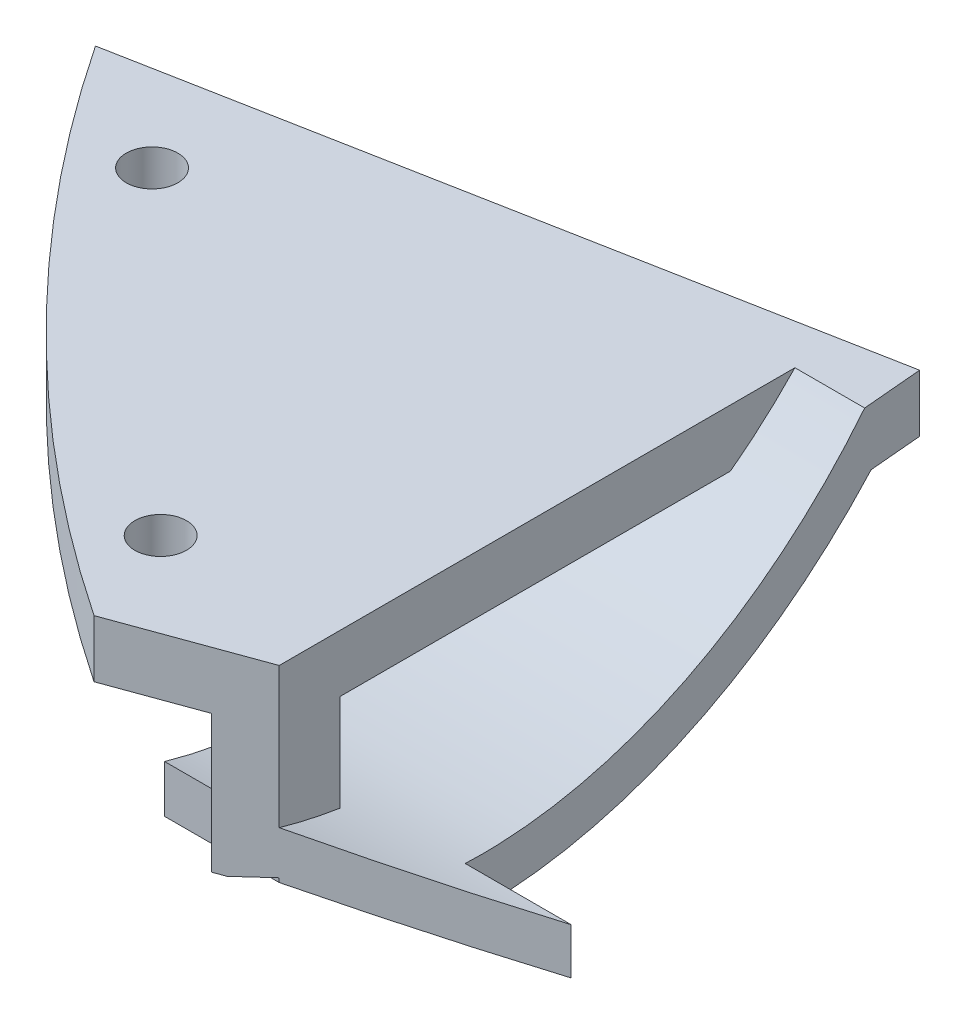
ISO-10303-21;
HEADER;
FILE_DESCRIPTION(('STEP AP214'),'2;1');
FILE_NAME('part.step','',(''),(''),'','','');
FILE_SCHEMA(('AUTOMOTIVE_DESIGN { 1 0 10303 214 1 1 1 1 }'));
ENDSEC;
DATA;
#1=APPLICATION_CONTEXT('core data for automotive mechanical design processes');
#2=APPLICATION_PROTOCOL_DEFINITION('international standard','automotive_design',2000,#1);
#3=PRODUCT_CONTEXT('',#1,'mechanical');
#4=PRODUCT('Part','Part','',(#3));
#5=PRODUCT_RELATED_PRODUCT_CATEGORY('part','',(#4));
#6=PRODUCT_DEFINITION_FORMATION('','',#4);
#7=PRODUCT_DEFINITION_CONTEXT('part definition',#1,'design');
#8=PRODUCT_DEFINITION('design','',#6,#7);
#9=PRODUCT_DEFINITION_SHAPE('','',#8);
#10=(LENGTH_UNIT() NAMED_UNIT(*) SI_UNIT(.MILLI.,.METRE.));
#11=(NAMED_UNIT(*) PLANE_ANGLE_UNIT() SI_UNIT($,.RADIAN.));
#12=(NAMED_UNIT(*) SI_UNIT($,.STERADIAN.) SOLID_ANGLE_UNIT());
#13=UNCERTAINTY_MEASURE_WITH_UNIT(LENGTH_MEASURE(1.E-05),#10,'distance_accuracy_value','');
#14=(GEOMETRIC_REPRESENTATION_CONTEXT(3) GLOBAL_UNCERTAINTY_ASSIGNED_CONTEXT((#13)) GLOBAL_UNIT_ASSIGNED_CONTEXT((#10,
#11,#12)) REPRESENTATION_CONTEXT('',''));
#15=CARTESIAN_POINT('',(0.,0.,0.));
#16=DIRECTION('',(0.,0.,1.));
#17=DIRECTION('',(1.,0.,0.));
#18=AXIS2_PLACEMENT_3D('',#15,#16,#17);
#19=CARTESIAN_POINT('',(-37.9651546045442,19.,318.674082204589));
#20=DIRECTION('',(0.342020143325665,0.,0.93969262078591));
#21=DIRECTION('',(0.93969262078591,0.,-0.342020143325665));
#22=AXIS2_PLACEMENT_3D('',#19,#20,#21);
#23=PLANE('',#22);
#24=DIRECTION('',(0.,1.,0.));
#25=VECTOR('',#24,1.);
#26=CARTESIAN_POINT('',(-75.,19.,332.153663559186));
#27=LINE('',#26,#25);
#28=CARTESIAN_POINT('',(-75.,5.55820362419372,332.153663559186));
#29=VERTEX_POINT('',#28);
#30=CARTESIAN_POINT('',(-75.,14.,332.153663559186));
#31=VERTEX_POINT('',#30);
#32=EDGE_CURVE('E265',#29,#31,#27,.T.);
#33=ORIENTED_EDGE('',*,*,#32,.F.);
#34=CARTESIAN_POINT('',(-55.5866397250579,50.,325.087778272021));
#35=DIRECTION('',(0.342020143325665,0.,0.93969262078591));
#36=DIRECTION('',(0.93969262078591,0.,-0.342020143325665));
#37=AXIS2_PLACEMENT_3D('',#34,#35,#36);
#38=ELLIPSE('',#37,131.57119800734,45.);
#39=CARTESIAN_POINT('',(-81.0430503794762,5.96418716293269,334.353154021486));
#40=VERTEX_POINT('',#39);
#41=EDGE_CURVE('E299',#29,#40,#38,.F.);
#42=ORIENTED_EDGE('',*,*,#41,.T.);
#43=DIRECTION('',(0.,1.,0.));
#44=VECTOR('',#43,1.);
#45=CARTESIAN_POINT('',(-81.0430503794762,1.99999999999995,334.353154021486));
#46=LINE('',#45,#44);
#47=CARTESIAN_POINT('',(-81.0430503794762,14.,334.353154021486));
#48=VERTEX_POINT('',#47);
#49=EDGE_CURVE('E204',#40,#48,#46,.T.);
#50=ORIENTED_EDGE('',*,*,#49,.T.);
#51=DIRECTION('',(0.93969262078591,0.,-0.342020143325665));
#52=VECTOR('',#51,1.);
#53=CARTESIAN_POINT('',(-81.0430503794762,14.,334.353154021486));
#54=LINE('',#53,#52);
#55=EDGE_CURVE('E200',#48,#31,#54,.T.);
#56=ORIENTED_EDGE('',*,*,#55,.T.);
#57=EDGE_LOOP('',(#33,#42,#50,#56));
#58=FACE_BOUND('',#57,.T.);
#59=ADVANCED_FACE('F45',(#58),#23,.F.);
#60=CARTESIAN_POINT('',(-97.2503972670714,1.99999999999995,289.82383441855));
#61=DIRECTION('',(-0.93969262078591,0.,0.342020143325664));
#62=DIRECTION('',(0.342020143325664,0.,0.93969262078591));
#63=AXIS2_PLACEMENT_3D('',#60,#61,#62);
#64=PLANE('',#63);
#65=CARTESIAN_POINT('',(-84.4153713615733,50.,325.087778272021));
#66=DIRECTION('',(-0.93969262078591,0.,0.342020143325664));
#67=DIRECTION('',(0.342020143325664,0.,0.93969262078591));
#68=AXIS2_PLACEMENT_3D('',#65,#66,#67);
#69=ELLIPSE('',#68,52.1447108513196,48.9999999999999);
#70=CARTESIAN_POINT('',(-80.8306802801993,1.99999999999995,334.936636073817));
#71=VERTEX_POINT('',#70);
#72=CARTESIAN_POINT('',(-79.9069542725612,2.5914793927486,337.474552421565));
#73=VERTEX_POINT('',#72);
#74=EDGE_CURVE('E316',#71,#73,#69,.T.);
#75=ORIENTED_EDGE('',*,*,#74,.F.);
#76=DIRECTION('',(0.342020143325664,0.,0.93969262078591));
#77=VECTOR('',#76,1.);
#78=CARTESIAN_POINT('',(-97.2503972670714,1.99999999999995,289.82383441855));
#79=LINE('',#78,#77);
#80=CARTESIAN_POINT('',(-79.3329496628478,1.99999999999995,339.051617125416));
#81=VERTEX_POINT('',#80);
#82=EDGE_CURVE('E205',#71,#81,#79,.T.);
#83=ORIENTED_EDGE('',*,*,#82,.T.);
#84=DIRECTION('',(0.,-1.,0.));
#85=VECTOR('',#84,1.);
#86=CARTESIAN_POINT('',(-79.3329496628478,1.99999999999995,339.051617125416));
#87=LINE('',#86,#85);
#88=CARTESIAN_POINT('',(-79.3329496628479,14.,339.051617125416));
#89=VERTEX_POINT('',#88);
#90=EDGE_CURVE('E216',#89,#81,#87,.T.);
#91=ORIENTED_EDGE('',*,*,#90,.F.);
#92=DIRECTION('',(0.342020143325664,0.,0.93969262078591));
#93=VECTOR('',#92,1.);
#94=CARTESIAN_POINT('',(-97.2503972670714,14.,289.82383441855));
#95=LINE('',#94,#93);
#96=EDGE_CURVE('E223',#48,#89,#95,.T.);
#97=ORIENTED_EDGE('',*,*,#96,.F.);
#98=ORIENTED_EDGE('',*,*,#49,.F.);
#99=CARTESIAN_POINT('',(-84.4153713615733,50.,325.087778272021));
#100=DIRECTION('',(-0.93969262078591,0.,0.342020143325664));
#101=DIRECTION('',(0.342020143325664,0.,0.93969262078591));
#102=AXIS2_PLACEMENT_3D('',#99,#100,#101);
#103=ELLIPSE('',#102,47.8879997614159,45.);
#104=CARTESIAN_POINT('',(-79.9069542725612,6.73837929332536,337.474552421565));
#105=VERTEX_POINT('',#104);
#106=EDGE_CURVE('E303',#105,#40,#103,.F.);
#107=ORIENTED_EDGE('',*,*,#106,.F.);
#108=DIRECTION('',(0.,1.,0.));
#109=VECTOR('',#108,1.);
#110=CARTESIAN_POINT('',(-79.9069542725612,1.99999999999995,337.474552421565));
#111=LINE('',#110,#109);
#112=EDGE_CURVE('E310',#73,#105,#111,.T.);
#113=ORIENTED_EDGE('',*,*,#112,.F.);
#114=EDGE_LOOP('',(#75,#83,#91,#97,#98,#107,#113));
#115=FACE_BOUND('',#114,.T.);
#116=ADVANCED_FACE('F353',(#115),#64,.T.);
#117=CARTESIAN_POINT('',(0.,14.,212.2));
#118=DIRECTION('',(0.,1.,0.));
#119=DIRECTION('',(0.,0.,1.));
#120=AXIS2_PLACEMENT_3D('',#117,#118,#119);
#121=PLANE('',#120);
#122=DIRECTION('',(0.982505588351476,0.,-0.186233103550686));
#123=VECTOR('',#122,1.);
#124=CARTESIAN_POINT('',(-50.7041128038612,14.,283.674082204589));
#125=LINE('',#124,#123);
#126=CARTESIAN_POINT('',(-129.839258727374,14.,298.674082204589));
#127=VERTEX_POINT('',#126);
#128=CARTESIAN_POINT('',(-69.3717189825393,14.,287.212511172052));
#129=VERTEX_POINT('',#128);
#130=EDGE_CURVE('E190',#127,#129,#125,.T.);
#131=ORIENTED_EDGE('',*,*,#130,.T.);
#132=DIRECTION('',(0.0871557427476548,0.,0.996194698091746));
#133=VECTOR('',#132,1.);
#134=CARTESIAN_POINT('',(-75.3576557717874,14.,218.79294058992));
#135=LINE('',#134,#133);
#136=CARTESIAN_POINT('',(-68.9663204156701,14.,291.846237994832));
#137=VERTEX_POINT('',#136);
#138=EDGE_CURVE('E168',#129,#137,#135,.T.);
#139=ORIENTED_EDGE('',*,*,#138,.T.);
#140=DIRECTION('',(1.,0.,0.));
#141=VECTOR('',#140,1.);
#142=CARTESIAN_POINT('',(-85.,14.,291.846237994832));
#143=LINE('',#142,#141);
#144=CARTESIAN_POINT('',(-85.,14.,291.846237994832));
#145=VERTEX_POINT('',#144);
#146=EDGE_CURVE('E68',#145,#137,#143,.T.);
#147=ORIENTED_EDGE('',*,*,#146,.F.);
#148=DIRECTION('',(0.,0.,1.));
#149=VECTOR('',#148,1.);
#150=CARTESIAN_POINT('',(-85.,14.,291.846237994832));
#151=LINE('',#150,#149);
#152=CARTESIAN_POINT('',(-85.,14.,298.087778272021));
#153=VERTEX_POINT('',#152);
#154=EDGE_CURVE('E437',#145,#153,#151,.T.);
#155=ORIENTED_EDGE('',*,*,#154,.T.);
#156=DIRECTION('',(1.,0.,0.));
#157=VECTOR('',#156,1.);
#158=CARTESIAN_POINT('',(-85.,13.9999999999999,298.087778272021));
#159=LINE('',#158,#157);
#160=CARTESIAN_POINT('',(-75.,13.9999999999999,298.087778272021));
#161=VERTEX_POINT('',#160);
#162=EDGE_CURVE('E286',#153,#161,#159,.T.);
#163=ORIENTED_EDGE('',*,*,#162,.T.);
#164=DIRECTION('',(0.,0.,-1.));
#165=VECTOR('',#164,1.);
#166=CARTESIAN_POINT('',(-75.,14.,212.2));
#167=LINE('',#166,#165);
#168=EDGE_CURVE('E329',#31,#161,#167,.T.);
#169=ORIENTED_EDGE('',*,*,#168,.F.);
#170=ORIENTED_EDGE('',*,*,#55,.F.);
#171=ORIENTED_EDGE('',*,*,#96,.T.);
#172=DIRECTION('',(0.93969262078591,0.,-0.342020143325664));
#173=VECTOR('',#172,1.);
#174=CARTESIAN_POINT('',(-86.8504906291351,14.,341.787778272021));
#175=LINE('',#174,#173);
#176=CARTESIAN_POINT('',(-86.8504906291351,14.,341.787778272021));
#177=VERTEX_POINT('',#176);
#178=EDGE_CURVE('E249',#177,#89,#175,.T.);
#179=ORIENTED_EDGE('',*,*,#178,.F.);
#180=CARTESIAN_POINT('',(0.,14.,212.2));
#181=DIRECTION('',(0.,1.,0.));
#182=DIRECTION('',(0.,0.,1.));
#183=AXIS2_PLACEMENT_3D('',#180,#181,#182);
#184=CIRCLE('',#183,156.);
#185=EDGE_CURVE('E241',#127,#177,#184,.T.);
#186=ORIENTED_EDGE('',*,*,#185,.F.);
#187=EDGE_LOOP('',(#131,#139,#147,#155,#163,#169,#170,#171,#179,#186));
#188=FACE_BOUND('',#187,.T.);
#189=CARTESIAN_POINT('',(-90.,14.,332.824417097037));
#190=DIRECTION('',(0.,1.,0.));
#191=DIRECTION('',(0.,0.,1.));
#192=AXIS2_PLACEMENT_3D('',#189,#190,#191);
#193=CIRCLE('',#192,2.25);
#194=CARTESIAN_POINT('',(-90.,14.,335.074417097037));
#195=VERTEX_POINT('',#194);
#196=EDGE_CURVE('E208',#195,#195,#193,.T.);
#197=ORIENTED_EDGE('',*,*,#196,.T.);
#198=EDGE_LOOP('',(#197));
#199=FACE_BOUND('',#198,.T.);
#200=CARTESIAN_POINT('',(-118.15322081512,14.,305.420525695866));
#201=DIRECTION('',(0.,1.,0.));
#202=DIRECTION('',(0.,0.,1.));
#203=AXIS2_PLACEMENT_3D('',#200,#201,#202);
#204=CIRCLE('',#203,2.25);
#205=CARTESIAN_POINT('',(-118.15322081512,14.,307.670525695866));
#206=VERTEX_POINT('',#205);
#207=EDGE_CURVE('E233',#206,#206,#204,.T.);
#208=ORIENTED_EDGE('',*,*,#207,.T.);
#209=EDGE_LOOP('',(#208));
#210=FACE_BOUND('',#209,.T.);
#211=ADVANCED_FACE('F274',(#188,#199,#210),#121,.F.);
#212=CARTESIAN_POINT('',(0.,19.,212.2));
#213=DIRECTION('',(0.,1.,0.));
#214=DIRECTION('',(0.,0.,1.));
#215=AXIS2_PLACEMENT_3D('',#212,#213,#214);
#216=PLANE('',#215);
#217=DIRECTION('',(0.0871557427476548,0.,0.996194698091746));
#218=VECTOR('',#217,1.);
#219=CARTESIAN_POINT('',(-69.3717189825393,19.,287.212511172052));
#220=LINE('',#219,#218);
#221=CARTESIAN_POINT('',(-69.3717189825393,19.,287.212511172052));
#222=VERTEX_POINT('',#221);
#223=CARTESIAN_POINT('',(-68.9118563239844,19.,292.468765411421));
#224=VERTEX_POINT('',#223);
#225=EDGE_CURVE('E166',#222,#224,#220,.T.);
#226=ORIENTED_EDGE('',*,*,#225,.F.);
#227=DIRECTION('',(-0.982505588351476,0.,0.186233103550686));
#228=VECTOR('',#227,1.);
#229=CARTESIAN_POINT('',(-50.7041128038612,19.,283.674082204589));
#230=LINE('',#229,#228);
#231=CARTESIAN_POINT('',(-129.839258727374,19.,298.674082204589));
#232=VERTEX_POINT('',#231);
#233=EDGE_CURVE('E179',#222,#232,#230,.T.);
#234=ORIENTED_EDGE('',*,*,#233,.T.);
#235=CARTESIAN_POINT('',(0.,19.,212.2));
#236=DIRECTION('',(0.,1.,0.));
#237=DIRECTION('',(0.,0.,1.));
#238=AXIS2_PLACEMENT_3D('',#235,#236,#237);
#239=CIRCLE('',#238,156.);
#240=CARTESIAN_POINT('',(-86.8504906291351,19.,341.787778272021));
#241=VERTEX_POINT('',#240);
#242=EDGE_CURVE('E245',#232,#241,#239,.T.);
#243=ORIENTED_EDGE('',*,*,#242,.T.);
#244=DIRECTION('',(0.93969262078591,0.,-0.342020143325664));
#245=VECTOR('',#244,1.);
#246=CARTESIAN_POINT('',(-86.8504906291351,19.,341.787778272021));
#247=LINE('',#246,#245);
#248=CARTESIAN_POINT('',(-75.,19.,337.474552421565));
#249=VERTEX_POINT('',#248);
#250=EDGE_CURVE('E248',#241,#249,#247,.T.);
#251=ORIENTED_EDGE('',*,*,#250,.T.);
#252=DIRECTION('',(0.,0.,-1.));
#253=VECTOR('',#252,1.);
#254=CARTESIAN_POINT('',(-75.,19.,212.2));
#255=LINE('',#254,#253);
#256=CARTESIAN_POINT('',(-75.,19.,292.468765411421));
#257=VERTEX_POINT('',#256);
#258=EDGE_CURVE('E191',#249,#257,#255,.T.);
#259=ORIENTED_EDGE('',*,*,#258,.T.);
#260=DIRECTION('',(1.,0.,0.));
#261=VECTOR('',#260,1.);
#262=CARTESIAN_POINT('',(-75.,19.,292.468765411421));
#263=LINE('',#262,#261);
#264=EDGE_CURVE('E182',#224,#257,#263,.F.);
#265=ORIENTED_EDGE('',*,*,#264,.F.);
#266=EDGE_LOOP('',(#226,#234,#243,#251,#259,#265));
#267=FACE_BOUND('',#266,.T.);
#268=CARTESIAN_POINT('',(-118.15322081512,19.,305.420525695866));
#269=DIRECTION('',(0.,1.,0.));
#270=DIRECTION('',(0.,0.,1.));
#271=AXIS2_PLACEMENT_3D('',#268,#269,#270);
#272=CIRCLE('',#271,2.25);
#273=CARTESIAN_POINT('',(-118.15322081512,19.,307.670525695866));
#274=VERTEX_POINT('',#273);
#275=EDGE_CURVE('E237',#274,#274,#272,.T.);
#276=ORIENTED_EDGE('',*,*,#275,.F.);
#277=EDGE_LOOP('',(#276));
#278=FACE_BOUND('',#277,.T.);
#279=CARTESIAN_POINT('',(-90.,19.,332.824417097037));
#280=DIRECTION('',(0.,1.,0.));
#281=DIRECTION('',(0.,0.,1.));
#282=AXIS2_PLACEMENT_3D('',#279,#280,#281);
#283=CIRCLE('',#282,2.25);
#284=CARTESIAN_POINT('',(-90.,19.,335.074417097037));
#285=VERTEX_POINT('',#284);
#286=EDGE_CURVE('E229',#285,#285,#283,.T.);
#287=ORIENTED_EDGE('',*,*,#286,.F.);
#288=EDGE_LOOP('',(#287));
#289=FACE_BOUND('',#288,.T.);
#290=ADVANCED_FACE('F176',(#267,#278,#289),#216,.T.);
#291=CARTESIAN_POINT('',(0.,19.,212.2));
#292=DIRECTION('',(0.,-1.,0.));
#293=DIRECTION('',(0.,0.,-1.));
#294=AXIS2_PLACEMENT_3D('',#291,#292,#293);
#295=CYLINDRICAL_SURFACE('',#294,156.);
#296=ORIENTED_EDGE('',*,*,#185,.T.);
#297=DIRECTION('',(0.,-1.,0.));
#298=VECTOR('',#297,1.);
#299=CARTESIAN_POINT('',(-86.8504906291351,19.,341.787778272021));
#300=LINE('',#299,#298);
#301=EDGE_CURVE('E261',#241,#177,#300,.T.);
#302=ORIENTED_EDGE('',*,*,#301,.F.);
#303=ORIENTED_EDGE('',*,*,#242,.F.);
#304=DIRECTION('',(0.,-1.,0.));
#305=VECTOR('',#304,1.);
#306=CARTESIAN_POINT('',(-129.839258727374,19.,298.674082204589));
#307=LINE('',#306,#305);
#308=EDGE_CURVE('E187',#232,#127,#307,.T.);
#309=ORIENTED_EDGE('',*,*,#308,.T.);
#310=EDGE_LOOP('',(#296,#302,#303,#309));
#311=FACE_BOUND('',#310,.T.);
#312=ADVANCED_FACE('F47',(#311),#295,.T.);
#313=CARTESIAN_POINT('',(-86.8504906291351,19.,341.787778272021));
#314=DIRECTION('',(-0.342020143325664,0.,-0.93969262078591));
#315=DIRECTION('',(-0.93969262078591,0.,0.342020143325664));
#316=AXIS2_PLACEMENT_3D('',#313,#314,#315);
#317=PLANE('',#316);
#318=CARTESIAN_POINT('',(-40.9676177242423,50.,325.087778272021));
#319=DIRECTION('',(-0.342020143325664,0.,-0.93969262078591));
#320=DIRECTION('',(-0.93969262078591,0.,0.342020143325664));
#321=AXIS2_PLACEMENT_3D('',#318,#319,#320);
#322=ELLIPSE('',#321,143.266415607993,48.9999999999999);
#323=CARTESIAN_POINT('',(-56.3158616371842,1.31947814194089,330.674082204589));
#324=VERTEX_POINT('',#323);
#325=CARTESIAN_POINT('',(-75.,2.59147939274862,337.474552421565));
#326=VERTEX_POINT('',#325);
#327=EDGE_CURVE('E423',#324,#326,#322,.T.);
#328=ORIENTED_EDGE('',*,*,#327,.F.);
#329=DIRECTION('',(0.,1.,0.));
#330=VECTOR('',#329,1.);
#331=CARTESIAN_POINT('',(-56.3158616371842,-67.,330.674082204589));
#332=LINE('',#331,#330);
#333=CARTESIAN_POINT('',(-56.3158616371842,5.34808841300327,330.674082204589));
#334=VERTEX_POINT('',#333);
#335=EDGE_CURVE('E279',#324,#334,#332,.T.);
#336=ORIENTED_EDGE('',*,*,#335,.T.);
#337=CARTESIAN_POINT('',(-40.9676177242423,50.,325.087778272021));
#338=DIRECTION('',(-0.342020143325664,0.,-0.93969262078591));
#339=DIRECTION('',(0.93969262078591,0.,-0.342020143325664));
#340=AXIS2_PLACEMENT_3D('',#337,#338,#339);
#341=ELLIPSE('',#340,131.57119800734,45.);
#342=CARTESIAN_POINT('',(-75.,6.73837929332535,337.474552421565));
#343=VERTEX_POINT('',#342);
#344=EDGE_CURVE('E324',#334,#343,#341,.T.);
#345=ORIENTED_EDGE('',*,*,#344,.T.);
#346=DIRECTION('',(0.,-1.,0.));
#347=VECTOR('',#346,1.);
#348=CARTESIAN_POINT('',(-75.,19.,337.474552421565));
#349=LINE('',#348,#347);
#350=EDGE_CURVE('E197',#249,#343,#349,.T.);
#351=ORIENTED_EDGE('',*,*,#350,.F.);
#352=ORIENTED_EDGE('',*,*,#250,.F.);
#353=ORIENTED_EDGE('',*,*,#301,.T.);
#354=ORIENTED_EDGE('',*,*,#178,.T.);
#355=ORIENTED_EDGE('',*,*,#90,.T.);
#356=DIRECTION('',(0.939692620785898,0.,-0.342020143325698));
#357=VECTOR('',#356,1.);
#358=CARTESIAN_POINT('',(-78.3388211391639,1.99999999999995,338.68978393376));
#359=LINE('',#358,#357);
#360=CARTESIAN_POINT('',(-78.3388211391639,1.99999999999995,338.68978393376));
#361=VERTEX_POINT('',#360);
#362=EDGE_CURVE('E195',#81,#361,#359,.T.);
#363=ORIENTED_EDGE('',*,*,#362,.T.);
#364=DIRECTION('',(0.907673371190372,0.258819045102515,-0.330366089549348));
#365=VECTOR('',#364,1.);
#366=CARTESIAN_POINT('',(-36.2550538879159,14.,323.372545308519));
#367=LINE('',#366,#365);
#368=CARTESIAN_POINT('',(-75.,2.95205007267443,337.474552421565));
#369=VERTEX_POINT('',#368);
#370=EDGE_CURVE('E212',#361,#369,#367,.T.);
#371=ORIENTED_EDGE('',*,*,#370,.T.);
#372=DIRECTION('',(0.,-1.,0.));
#373=VECTOR('',#372,1.);
#374=CARTESIAN_POINT('',(-75.,2.5914793927486,337.474552421565));
#375=LINE('',#374,#373);
#376=EDGE_CURVE('E426',#369,#326,#375,.T.);
#377=ORIENTED_EDGE('',*,*,#376,.T.);
#378=EDGE_LOOP('',(#328,#336,#345,#351,#352,#353,#354,#355,#363,#371,#377));
#379=FACE_BOUND('',#378,.T.);
#380=ADVANCED_FACE('F361',(#379),#317,.F.);
#381=CARTESIAN_POINT('',(-118.15322081512,19.,305.420525695866));
#382=DIRECTION('',(0.,-1.,0.));
#383=DIRECTION('',(0.,0.,-1.));
#384=AXIS2_PLACEMENT_3D('',#381,#382,#383);
#385=CYLINDRICAL_SURFACE('',#384,2.25);
#386=ORIENTED_EDGE('',*,*,#275,.T.);
#387=EDGE_LOOP('',(#386));
#388=FACE_BOUND('',#387,.T.);
#389=ORIENTED_EDGE('',*,*,#207,.F.);
#390=EDGE_LOOP('',(#389));
#391=FACE_BOUND('',#390,.T.);
#392=ADVANCED_FACE('F369',(#388,#391),#385,.F.);
#393=CARTESIAN_POINT('',(-90.,19.,332.824417097037));
#394=DIRECTION('',(0.,-1.,0.));
#395=DIRECTION('',(0.,0.,-1.));
#396=AXIS2_PLACEMENT_3D('',#393,#394,#395);
#397=CYLINDRICAL_SURFACE('',#396,2.25);
#398=ORIENTED_EDGE('',*,*,#286,.T.);
#399=EDGE_LOOP('',(#398));
#400=FACE_BOUND('',#399,.T.);
#401=ORIENTED_EDGE('',*,*,#196,.F.);
#402=EDGE_LOOP('',(#401));
#403=FACE_BOUND('',#402,.T.);
#404=ADVANCED_FACE('F382',(#400,#403),#397,.F.);
#405=CARTESIAN_POINT('',(-96.2562687433874,1.99999999999995,289.462001226894));
#406=DIRECTION('',(0.,-1.,0.));
#407=DIRECTION('',(0.,0.,-1.));
#408=AXIS2_PLACEMENT_3D('',#405,#406,#407);
#409=PLANE('',#408);
#410=DIRECTION('',(1.,0.,0.));
#411=VECTOR('',#410,1.);
#412=CARTESIAN_POINT('',(-85.,1.99999999999995,334.936636073817));
#413=LINE('',#412,#411);
#414=CARTESIAN_POINT('',(-79.704855244983,1.99999999999995,334.936636073817));
#415=VERTEX_POINT('',#414);
#416=EDGE_CURVE('E313',#415,#71,#413,.F.);
#417=ORIENTED_EDGE('',*,*,#416,.F.);
#418=DIRECTION('',(0.342020143325664,0.,0.93969262078591));
#419=VECTOR('',#418,1.);
#420=CARTESIAN_POINT('',(-96.2562687433874,1.99999999999995,289.462001226894));
#421=LINE('',#420,#419);
#422=EDGE_CURVE('E220',#415,#361,#421,.T.);
#423=ORIENTED_EDGE('',*,*,#422,.T.);
#424=ORIENTED_EDGE('',*,*,#362,.F.);
#425=ORIENTED_EDGE('',*,*,#82,.F.);
#426=EDGE_LOOP('',(#417,#423,#424,#425));
#427=FACE_BOUND('',#426,.T.);
#428=ADVANCED_FACE('F385',(#427),#409,.T.);
#429=CARTESIAN_POINT('',(-54.1725014921394,14.,274.144762601653));
#430=DIRECTION('',(0.243210346801688,-0.96592582628907,-0.0885213269013736));
#431=DIRECTION('',(0.969732723779452,0.244168885059674,0.));
#432=AXIS2_PLACEMENT_3D('',#429,#430,#431);
#433=PLANE('',#432);
#434=CARTESIAN_POINT('',(107.345598401595,50.,325.087778272021));
#435=DIRECTION('',(0.243210346801688,-0.96592582628907,-0.0885213269013736));
#436=DIRECTION('',(0.969973570366019,0.242195418899738,0.0221957621040176));
#437=AXIS2_PLACEMENT_3D('',#434,#435,#436);
#438=ELLIPSE('',#437,201.471691662666,48.9999999999999);
#439=CARTESIAN_POINT('',(-76.4320300781734,2.59147939274859,337.474552421565));
#440=VERTEX_POINT('',#439);
#441=EDGE_CURVE('E268',#440,#415,#438,.T.);
#442=ORIENTED_EDGE('',*,*,#441,.F.);
#443=DIRECTION('',(-0.969732723779452,-0.244168885059674,0.));
#444=VECTOR('',#443,1.);
#445=CARTESIAN_POINT('',(-52.7982869022438,8.54221672433297,337.474552421565));
#446=LINE('',#445,#444);
#447=EDGE_CURVE('E307',#369,#440,#446,.T.);
#448=ORIENTED_EDGE('',*,*,#447,.F.);
#449=ORIENTED_EDGE('',*,*,#370,.F.);
#450=ORIENTED_EDGE('',*,*,#422,.F.);
#451=EDGE_LOOP('',(#442,#448,#449,#450));
#452=FACE_BOUND('',#451,.T.);
#453=ADVANCED_FACE('F389',(#452),#433,.T.);
#454=CARTESIAN_POINT('',(-50.7041128038612,-84.3150599266081,283.674082204589));
#455=DIRECTION('',(-0.186233103550686,0.,-0.982505588351476));
#456=DIRECTION('',(-0.982505588351476,0.,0.186233103550686));
#457=AXIS2_PLACEMENT_3D('',#454,#455,#456);
#458=PLANE('',#457);
#459=DIRECTION('',(0.,1.,0.));
#460=VECTOR('',#459,1.);
#461=CARTESIAN_POINT('',(-69.3717189825393,-67.,287.212511172052));
#462=LINE('',#461,#460);
#463=EDGE_CURVE('E163',#129,#222,#462,.T.);
#464=ORIENTED_EDGE('',*,*,#463,.F.);
#465=ORIENTED_EDGE('',*,*,#130,.F.);
#466=ORIENTED_EDGE('',*,*,#308,.F.);
#467=ORIENTED_EDGE('',*,*,#233,.F.);
#468=EDGE_LOOP('',(#464,#465,#466,#467));
#469=FACE_BOUND('',#468,.T.);
#470=ADVANCED_FACE('F185',(#469),#458,.T.);
#471=CARTESIAN_POINT('',(-75.,50.,325.087778272021));
#472=DIRECTION('',(1.,0.,0.));
#473=DIRECTION('',(0.,0.,-1.));
#474=AXIS2_PLACEMENT_3D('',#471,#472,#473);
#475=PLANE('',#474);
#476=ORIENTED_EDGE('',*,*,#350,.T.);
#477=CARTESIAN_POINT('',(-75.,50.,325.087778272021));
#478=DIRECTION('',(1.,0.,0.));
#479=DIRECTION('',(0.,0.,-1.));
#480=AXIS2_PLACEMENT_3D('',#477,#478,#479);
#481=CIRCLE('',#480,45.);
#482=EDGE_CURVE('E320',#343,#29,#481,.T.);
#483=ORIENTED_EDGE('',*,*,#482,.T.);
#484=ORIENTED_EDGE('',*,*,#32,.T.);
#485=ORIENTED_EDGE('',*,*,#168,.T.);
#486=EDGE_CURVE('E319',#161,#257,#481,.T.);
#487=ORIENTED_EDGE('',*,*,#486,.T.);
#488=ORIENTED_EDGE('',*,*,#258,.F.);
#489=EDGE_LOOP('',(#476,#483,#484,#485,#487,#488));
#490=FACE_BOUND('',#489,.T.);
#491=ADVANCED_FACE('F338',(#490),#475,.T.);
#492=CARTESIAN_POINT('',(-75.,50.,325.087778272021));
#493=DIRECTION('',(1.,0.,0.));
#494=DIRECTION('',(0.,0.,-1.));
#495=AXIS2_PLACEMENT_3D('',#492,#493,#494);
#496=CYLINDRICAL_SURFACE('',#495,45.);
#497=ORIENTED_EDGE('',*,*,#344,.F.);
#498=DIRECTION('',(1.,0.,0.));
#499=VECTOR('',#498,1.);
#500=CARTESIAN_POINT('',(-75.,5.34808841300326,330.674082204589));
#501=LINE('',#500,#499);
#502=CARTESIAN_POINT('',(-65.5693242181657,5.34808841300324,330.674082204589));
#503=VERTEX_POINT('',#502);
#504=EDGE_CURVE('E419',#334,#503,#501,.F.);
#505=ORIENTED_EDGE('',*,*,#504,.T.);
#506=CARTESIAN_POINT('',(-66.0580624832757,50.,325.087778272021));
#507=DIRECTION('',(-0.996194698091746,0.,0.0871557427476548));
#508=DIRECTION('',(0.0871557427476548,0.,0.996194698091746));
#509=AXIS2_PLACEMENT_3D('',#506,#507,#508);
#510=ELLIPSE('',#509,45.1718926894506,45.);
#511=EDGE_CURVE('E278',#503,#224,#510,.F.);
#512=ORIENTED_EDGE('',*,*,#511,.T.);
#513=ORIENTED_EDGE('',*,*,#264,.T.);
#514=ORIENTED_EDGE('',*,*,#486,.F.);
#515=ORIENTED_EDGE('',*,*,#162,.F.);
#516=CARTESIAN_POINT('',(-85.,50.,325.087778272021));
#517=DIRECTION('',(-1.,0.,0.));
#518=DIRECTION('',(0.,0.,-1.));
#519=AXIS2_PLACEMENT_3D('',#516,#517,#518);
#520=CIRCLE('',#519,45.);
#521=CARTESIAN_POINT('',(-85.,6.73837929332536,337.474552421565));
#522=VERTEX_POINT('',#521);
#523=EDGE_CURVE('E295',#153,#522,#520,.T.);
#524=ORIENTED_EDGE('',*,*,#523,.T.);
#525=DIRECTION('',(1.,0.,0.));
#526=VECTOR('',#525,1.);
#527=CARTESIAN_POINT('',(-85.,6.73837929332536,337.474552421565));
#528=LINE('',#527,#526);
#529=EDGE_CURVE('E292',#522,#105,#528,.T.);
#530=ORIENTED_EDGE('',*,*,#529,.T.);
#531=ORIENTED_EDGE('',*,*,#106,.T.);
#532=ORIENTED_EDGE('',*,*,#41,.F.);
#533=ORIENTED_EDGE('',*,*,#482,.F.);
#534=EDGE_LOOP('',(#497,#505,#512,#513,#514,#515,#524,#530,#531,#532,#533));
#535=FACE_BOUND('',#534,.T.);
#536=ADVANCED_FACE('F344',(#535),#496,.F.);
#537=CARTESIAN_POINT('',(-85.,2.5914793927486,337.474552421565));
#538=DIRECTION('',(0.,0.,1.));
#539=DIRECTION('',(1.,0.,0.));
#540=AXIS2_PLACEMENT_3D('',#537,#538,#539);
#541=PLANE('',#540);
#542=DIRECTION('',(1.,0.,0.));
#543=VECTOR('',#542,1.);
#544=CARTESIAN_POINT('',(-85.,2.5914793927486,337.474552421565));
#545=LINE('',#544,#543);
#546=CARTESIAN_POINT('',(-85.,2.5914793927486,337.474552421565));
#547=VERTEX_POINT('',#546);
#548=EDGE_CURVE('E304',#547,#73,#545,.T.);
#549=ORIENTED_EDGE('',*,*,#548,.T.);
#550=ORIENTED_EDGE('',*,*,#112,.T.);
#551=ORIENTED_EDGE('',*,*,#529,.F.);
#552=DIRECTION('',(0.,-1.,0.));
#553=VECTOR('',#552,1.);
#554=CARTESIAN_POINT('',(-85.,2.5914793927486,337.474552421565));
#555=LINE('',#554,#553);
#556=EDGE_CURVE('E287',#522,#547,#555,.T.);
#557=ORIENTED_EDGE('',*,*,#556,.T.);
#558=EDGE_LOOP('',(#549,#550,#551,#557));
#559=FACE_BOUND('',#558,.T.);
#560=ADVANCED_FACE('F398',(#559),#541,.T.);
#561=CARTESIAN_POINT('',(-85.,50.,325.087778272021));
#562=DIRECTION('',(1.,0.,0.));
#563=DIRECTION('',(0.,0.,-1.));
#564=AXIS2_PLACEMENT_3D('',#561,#562,#563);
#565=CYLINDRICAL_SURFACE('',#564,48.9999999999999);
#566=DIRECTION('',(1.,0.,0.));
#567=VECTOR('',#566,1.);
#568=CARTESIAN_POINT('',(-85.,1.31947814194088,330.674082204589));
#569=LINE('',#568,#567);
#570=CARTESIAN_POINT('',(-65.5693242181657,1.31947814194086,330.674082204589));
#571=VERTEX_POINT('',#570);
#572=EDGE_CURVE('E11',#324,#571,#569,.F.);
#573=ORIENTED_EDGE('',*,*,#572,.F.);
#574=ORIENTED_EDGE('',*,*,#327,.T.);
#575=EDGE_CURVE('E445',#440,#326,#545,.T.);
#576=ORIENTED_EDGE('',*,*,#575,.F.);
#577=ORIENTED_EDGE('',*,*,#441,.T.);
#578=ORIENTED_EDGE('',*,*,#416,.T.);
#579=ORIENTED_EDGE('',*,*,#74,.T.);
#580=ORIENTED_EDGE('',*,*,#548,.F.);
#581=CARTESIAN_POINT('',(-85.,50.,325.087778272021));
#582=DIRECTION('',(1.,0.,0.));
#583=DIRECTION('',(0.,0.,-1.));
#584=AXIS2_PLACEMENT_3D('',#581,#582,#583);
#585=CIRCLE('',#584,48.9999999999999);
#586=EDGE_CURVE('E284',#547,#145,#585,.T.);
#587=ORIENTED_EDGE('',*,*,#586,.T.);
#588=ORIENTED_EDGE('',*,*,#146,.T.);
#589=CARTESIAN_POINT('',(-66.0580624832757,50.,325.087778272021));
#590=DIRECTION('',(-0.996194698091746,0.,0.0871557427476548));
#591=DIRECTION('',(0.0871557427476548,0.,0.996194698091746));
#592=AXIS2_PLACEMENT_3D('',#589,#590,#591);
#593=ELLIPSE('',#592,49.187172039624,48.9999999999999);
#594=EDGE_CURVE('E54',#571,#137,#593,.F.);
#595=ORIENTED_EDGE('',*,*,#594,.F.);
#596=EDGE_LOOP('',(#573,#574,#576,#577,#578,#579,#580,#587,#588,#595));
#597=FACE_BOUND('',#596,.T.);
#598=ADVANCED_FACE('F282',(#597),#565,.T.);
#599=ORIENTED_EDGE('',*,*,#376,.F.);
#600=ORIENTED_EDGE('',*,*,#447,.T.);
#601=ORIENTED_EDGE('',*,*,#575,.T.);
#602=EDGE_LOOP('',(#599,#600,#601));
#603=FACE_BOUND('',#602,.T.);
#604=ADVANCED_FACE('F403',(#603),#541,.T.);
#605=CARTESIAN_POINT('',(-85.,50.,325.087778272021));
#606=DIRECTION('',(1.,0.,0.));
#607=DIRECTION('',(0.,0.,-1.));
#608=AXIS2_PLACEMENT_3D('',#605,#606,#607);
#609=PLANE('',#608);
#610=ORIENTED_EDGE('',*,*,#586,.F.);
#611=ORIENTED_EDGE('',*,*,#556,.F.);
#612=ORIENTED_EDGE('',*,*,#523,.F.);
#613=ORIENTED_EDGE('',*,*,#154,.F.);
#614=EDGE_LOOP('',(#610,#611,#612,#613));
#615=FACE_BOUND('',#614,.T.);
#616=ADVANCED_FACE('F406',(#615),#609,.F.);
#617=CARTESIAN_POINT('',(-65.5693242181657,-67.,330.674082204589));
#618=DIRECTION('',(0.,0.,1.));
#619=DIRECTION('',(1.,0.,0.));
#620=AXIS2_PLACEMENT_3D('',#617,#618,#619);
#621=PLANE('',#620);
#622=ORIENTED_EDGE('',*,*,#335,.F.);
#623=ORIENTED_EDGE('',*,*,#572,.T.);
#624=DIRECTION('',(0.,1.,0.));
#625=VECTOR('',#624,1.);
#626=CARTESIAN_POINT('',(-65.5693242181657,-67.,330.674082204589));
#627=LINE('',#626,#625);
#628=EDGE_CURVE('E61',#571,#503,#627,.T.);
#629=ORIENTED_EDGE('',*,*,#628,.T.);
#630=ORIENTED_EDGE('',*,*,#504,.F.);
#631=EDGE_LOOP('',(#622,#623,#629,#630));
#632=FACE_BOUND('',#631,.T.);
#633=ADVANCED_FACE('F410',(#632),#621,.F.);
#634=CARTESIAN_POINT('',(-69.3717189825393,-67.,287.212511172052));
#635=DIRECTION('',(-0.996194698091746,0.,0.0871557427476548));
#636=DIRECTION('',(0.0871557427476548,0.,0.996194698091746));
#637=AXIS2_PLACEMENT_3D('',#634,#635,#636);
#638=PLANE('',#637);
#639=ORIENTED_EDGE('',*,*,#628,.F.);
#640=ORIENTED_EDGE('',*,*,#594,.T.);
#641=ORIENTED_EDGE('',*,*,#138,.F.);
#642=ORIENTED_EDGE('',*,*,#463,.T.);
#643=ORIENTED_EDGE('',*,*,#225,.T.);
#644=ORIENTED_EDGE('',*,*,#511,.F.);
#645=EDGE_LOOP('',(#639,#640,#641,#642,#643,#644));
#646=FACE_BOUND('',#645,.T.);
#647=ADVANCED_FACE('F165',(#646),#638,.F.);
#648=CLOSED_SHELL('',(#59,#116,#211,#290,#312,#380,#392,#404,#428,#453,#470,#491,#536,#560,#598,
#604,#616,#633,#647));
#649=MANIFOLD_SOLID_BREP('B2',#648);
#650=ADVANCED_BREP_SHAPE_REPRESENTATION('',(#18,#649),#14);
#651=SHAPE_DEFINITION_REPRESENTATION(#9,#650);
ENDSEC;
END-ISO-10303-21;
